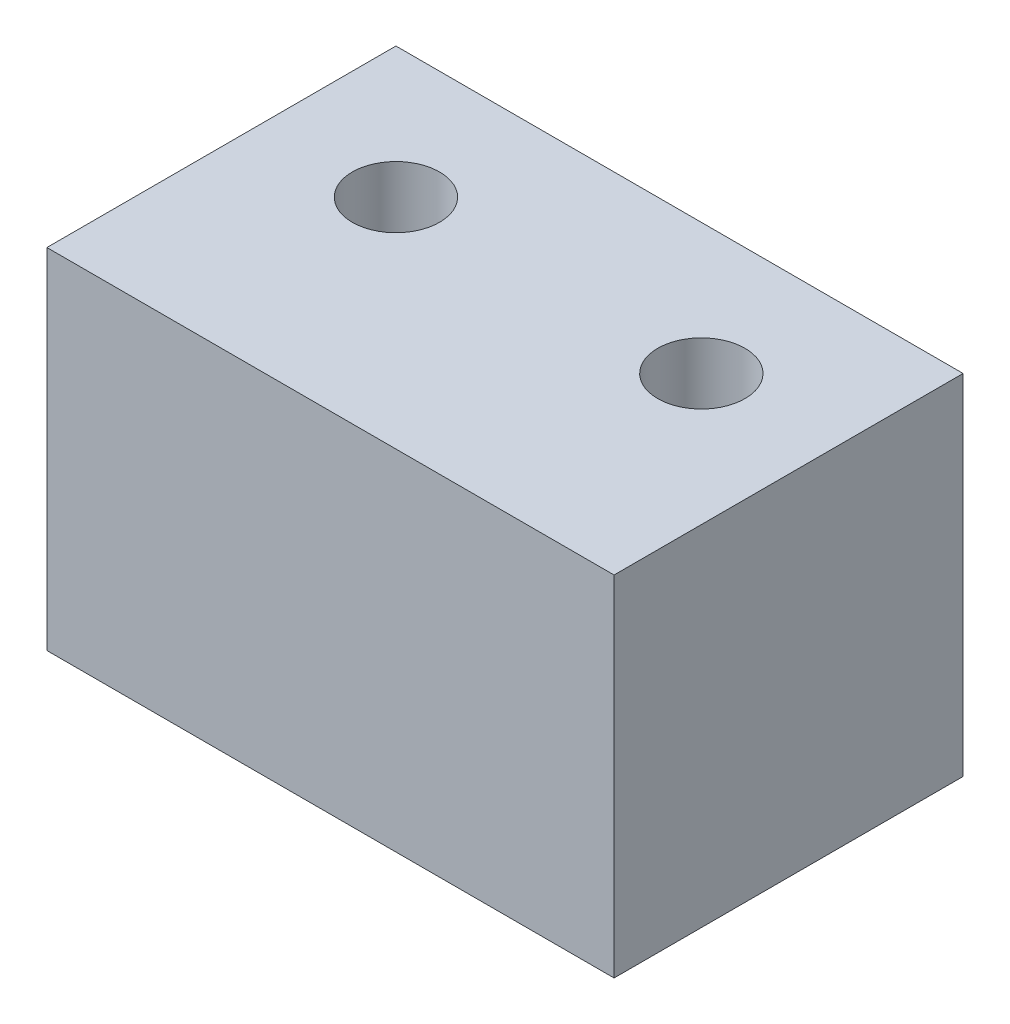
ISO-10303-21;
HEADER;
FILE_DESCRIPTION(('STEP AP214'),'2;1');
FILE_NAME('part.step','',(''),(''),'','','');
FILE_SCHEMA(('AUTOMOTIVE_DESIGN { 1 0 10303 214 1 1 1 1 }'));
ENDSEC;
DATA;
#1=APPLICATION_CONTEXT('core data for automotive mechanical design processes');
#2=APPLICATION_PROTOCOL_DEFINITION('international standard','automotive_design',2000,#1);
#3=PRODUCT_CONTEXT('',#1,'mechanical');
#4=PRODUCT('Part','Part','',(#3));
#5=PRODUCT_RELATED_PRODUCT_CATEGORY('part','',(#4));
#6=PRODUCT_DEFINITION_FORMATION('','',#4);
#7=PRODUCT_DEFINITION_CONTEXT('part definition',#1,'design');
#8=PRODUCT_DEFINITION('design','',#6,#7);
#9=PRODUCT_DEFINITION_SHAPE('','',#8);
#10=(LENGTH_UNIT() NAMED_UNIT(*) SI_UNIT(.MILLI.,.METRE.));
#11=(NAMED_UNIT(*) PLANE_ANGLE_UNIT() SI_UNIT($,.RADIAN.));
#12=(NAMED_UNIT(*) SI_UNIT($,.STERADIAN.) SOLID_ANGLE_UNIT());
#13=UNCERTAINTY_MEASURE_WITH_UNIT(LENGTH_MEASURE(1.E-05),#10,'distance_accuracy_value','');
#14=(GEOMETRIC_REPRESENTATION_CONTEXT(3) GLOBAL_UNCERTAINTY_ASSIGNED_CONTEXT((#13)) GLOBAL_UNIT_ASSIGNED_CONTEXT((#10,
#11,#12)) REPRESENTATION_CONTEXT('',''));
#15=CARTESIAN_POINT('',(0.,0.,0.));
#16=DIRECTION('',(0.,0.,1.));
#17=DIRECTION('',(1.,0.,0.));
#18=AXIS2_PLACEMENT_3D('',#15,#16,#17);
#19=CARTESIAN_POINT('',(-41.275,25.4,25.4));
#20=DIRECTION('',(-1.,0.,0.));
#21=DIRECTION('',(0.,0.,1.));
#22=AXIS2_PLACEMENT_3D('',#19,#20,#21);
#23=PLANE('',#22);
#24=CARTESIAN_POINT('',(-41.275,12.7,0.));
#25=DIRECTION('',(-1.,0.,0.));
#26=DIRECTION('',(0.,0.,1.));
#27=AXIS2_PLACEMENT_3D('',#24,#25,#26);
#28=CIRCLE('',#27,2.55269999999999);
#29=CARTESIAN_POINT('',(-41.275,12.7,2.55269999999999));
#30=VERTEX_POINT('',#29);
#31=EDGE_CURVE('E105',#30,#30,#28,.T.);
#32=ORIENTED_EDGE('',*,*,#31,.F.);
#33=EDGE_LOOP('',(#32));
#34=FACE_BOUND('',#33,.T.);
#35=CARTESIAN_POINT('',(-41.275,-12.7,0.));
#36=DIRECTION('',(-1.,0.,0.));
#37=DIRECTION('',(0.,0.,1.));
#38=AXIS2_PLACEMENT_3D('',#35,#36,#37);
#39=CIRCLE('',#38,2.55269999999999);
#40=CARTESIAN_POINT('',(-41.275,-12.7,2.55269999999999));
#41=VERTEX_POINT('',#40);
#42=EDGE_CURVE('E104',#41,#41,#39,.T.);
#43=ORIENTED_EDGE('',*,*,#42,.F.);
#44=EDGE_LOOP('',(#43));
#45=FACE_BOUND('',#44,.T.);
#46=DIRECTION('',(0.,0.,-1.));
#47=VECTOR('',#46,1.);
#48=CARTESIAN_POINT('',(-41.275,-25.4,25.4));
#49=LINE('',#48,#47);
#50=CARTESIAN_POINT('',(-41.275,-25.4,25.4));
#51=VERTEX_POINT('',#50);
#52=CARTESIAN_POINT('',(-41.275,-25.4,-25.4));
#53=VERTEX_POINT('',#52);
#54=EDGE_CURVE('E134',#51,#53,#49,.T.);
#55=ORIENTED_EDGE('',*,*,#54,.F.);
#56=DIRECTION('',(0.,-1.,0.));
#57=VECTOR('',#56,1.);
#58=CARTESIAN_POINT('',(-41.275,25.4,25.4));
#59=LINE('',#58,#57);
#60=CARTESIAN_POINT('',(-41.275,25.4,25.4));
#61=VERTEX_POINT('',#60);
#62=EDGE_CURVE('E11',#61,#51,#59,.T.);
#63=ORIENTED_EDGE('',*,*,#62,.F.);
#64=DIRECTION('',(0.,0.,-1.));
#65=VECTOR('',#64,1.);
#66=CARTESIAN_POINT('',(-41.275,25.4,25.4));
#67=LINE('',#66,#65);
#68=CARTESIAN_POINT('',(-41.275,25.4,-25.4));
#69=VERTEX_POINT('',#68);
#70=EDGE_CURVE('E135',#61,#69,#67,.T.);
#71=ORIENTED_EDGE('',*,*,#70,.T.);
#72=DIRECTION('',(0.,-1.,0.));
#73=VECTOR('',#72,1.);
#74=CARTESIAN_POINT('',(-41.275,25.4,-25.4));
#75=LINE('',#74,#73);
#76=EDGE_CURVE('E45',#69,#53,#75,.T.);
#77=ORIENTED_EDGE('',*,*,#76,.T.);
#78=EDGE_LOOP('',(#55,#63,#71,#77));
#79=FACE_BOUND('',#78,.T.);
#80=ADVANCED_FACE('F42',(#34,#45,#79),#23,.T.);
#81=CARTESIAN_POINT('',(-41.275,25.4,25.4));
#82=DIRECTION('',(0.,0.,-1.));
#83=DIRECTION('',(-1.,0.,0.));
#84=AXIS2_PLACEMENT_3D('',#81,#82,#83);
#85=PLANE('',#84);
#86=DIRECTION('',(1.,0.,0.));
#87=VECTOR('',#86,1.);
#88=CARTESIAN_POINT('',(-41.275,-25.4,25.4));
#89=LINE('',#88,#87);
#90=CARTESIAN_POINT('',(41.275,-25.4,25.4));
#91=VERTEX_POINT('',#90);
#92=EDGE_CURVE('E77',#51,#91,#89,.T.);
#93=ORIENTED_EDGE('',*,*,#92,.T.);
#94=DIRECTION('',(0.,-1.,0.));
#95=VECTOR('',#94,1.);
#96=CARTESIAN_POINT('',(41.275,25.4,25.4));
#97=LINE('',#96,#95);
#98=CARTESIAN_POINT('',(41.275,25.4,25.4));
#99=VERTEX_POINT('',#98);
#100=EDGE_CURVE('E52',#99,#91,#97,.T.);
#101=ORIENTED_EDGE('',*,*,#100,.F.);
#102=DIRECTION('',(1.,0.,0.));
#103=VECTOR('',#102,1.);
#104=CARTESIAN_POINT('',(-41.275,25.4,25.4));
#105=LINE('',#104,#103);
#106=EDGE_CURVE('E144',#61,#99,#105,.T.);
#107=ORIENTED_EDGE('',*,*,#106,.F.);
#108=ORIENTED_EDGE('',*,*,#62,.T.);
#109=EDGE_LOOP('',(#93,#101,#107,#108));
#110=FACE_BOUND('',#109,.T.);
#111=ADVANCED_FACE('F173',(#110),#85,.F.);
#112=CARTESIAN_POINT('',(41.275,25.4,25.4));
#113=DIRECTION('',(-1.,0.,0.));
#114=DIRECTION('',(0.,0.,1.));
#115=AXIS2_PLACEMENT_3D('',#112,#113,#114);
#116=PLANE('',#115);
#117=DIRECTION('',(0.,0.,-1.));
#118=VECTOR('',#117,1.);
#119=CARTESIAN_POINT('',(41.275,-25.4,25.4));
#120=LINE('',#119,#118);
#121=CARTESIAN_POINT('',(41.275,-25.4,-25.4));
#122=VERTEX_POINT('',#121);
#123=EDGE_CURVE('E154',#91,#122,#120,.T.);
#124=ORIENTED_EDGE('',*,*,#123,.T.);
#125=DIRECTION('',(0.,-1.,0.));
#126=VECTOR('',#125,1.);
#127=CARTESIAN_POINT('',(41.275,25.4,-25.4));
#128=LINE('',#127,#126);
#129=CARTESIAN_POINT('',(41.275,25.4,-25.4));
#130=VERTEX_POINT('',#129);
#131=EDGE_CURVE('E161',#130,#122,#128,.T.);
#132=ORIENTED_EDGE('',*,*,#131,.F.);
#133=DIRECTION('',(0.,0.,-1.));
#134=VECTOR('',#133,1.);
#135=CARTESIAN_POINT('',(41.275,25.4,25.4));
#136=LINE('',#135,#134);
#137=EDGE_CURVE('E141',#99,#130,#136,.T.);
#138=ORIENTED_EDGE('',*,*,#137,.F.);
#139=ORIENTED_EDGE('',*,*,#100,.T.);
#140=EDGE_LOOP('',(#124,#132,#138,#139));
#141=FACE_BOUND('',#140,.T.);
#142=ADVANCED_FACE('F171',(#141),#116,.F.);
#143=CARTESIAN_POINT('',(-41.275,25.4,-25.4));
#144=DIRECTION('',(0.,0.,-1.));
#145=DIRECTION('',(-1.,0.,0.));
#146=AXIS2_PLACEMENT_3D('',#143,#144,#145);
#147=PLANE('',#146);
#148=DIRECTION('',(1.,0.,0.));
#149=VECTOR('',#148,1.);
#150=CARTESIAN_POINT('',(-41.275,-25.4,-25.4));
#151=LINE('',#150,#149);
#152=EDGE_CURVE('E150',#53,#122,#151,.T.);
#153=ORIENTED_EDGE('',*,*,#152,.F.);
#154=ORIENTED_EDGE('',*,*,#76,.F.);
#155=DIRECTION('',(1.,0.,0.));
#156=VECTOR('',#155,1.);
#157=CARTESIAN_POINT('',(-41.275,25.4,-25.4));
#158=LINE('',#157,#156);
#159=EDGE_CURVE('E138',#69,#130,#158,.T.);
#160=ORIENTED_EDGE('',*,*,#159,.T.);
#161=ORIENTED_EDGE('',*,*,#131,.T.);
#162=EDGE_LOOP('',(#153,#154,#160,#161));
#163=FACE_BOUND('',#162,.T.);
#164=ADVANCED_FACE('F166',(#163),#147,.T.);
#165=CARTESIAN_POINT('',(0.,25.4,0.));
#166=DIRECTION('',(0.,-1.,0.));
#167=DIRECTION('',(0.,0.,-1.));
#168=AXIS2_PLACEMENT_3D('',#165,#166,#167);
#169=PLANE('',#168);
#170=CARTESIAN_POINT('',(22.225,25.4,-6.34999999999999));
#171=DIRECTION('',(0.,1.,0.));
#172=DIRECTION('',(0.,0.,1.));
#173=AXIS2_PLACEMENT_3D('',#170,#171,#172);
#174=CIRCLE('',#173,6.34999999999999);
#175=CARTESIAN_POINT('',(22.225,25.4,0.));
#176=VERTEX_POINT('',#175);
#177=EDGE_CURVE('E118',#176,#176,#174,.T.);
#178=ORIENTED_EDGE('',*,*,#177,.F.);
#179=EDGE_LOOP('',(#178));
#180=FACE_BOUND('',#179,.T.);
#181=CARTESIAN_POINT('',(-22.225,25.4,-6.34999999999999));
#182=DIRECTION('',(0.,1.,0.));
#183=DIRECTION('',(0.,0.,1.));
#184=AXIS2_PLACEMENT_3D('',#181,#182,#183);
#185=CIRCLE('',#184,6.34999999999999);
#186=CARTESIAN_POINT('',(-22.225,25.4,0.));
#187=VERTEX_POINT('',#186);
#188=EDGE_CURVE('E126',#187,#187,#185,.T.);
#189=ORIENTED_EDGE('',*,*,#188,.F.);
#190=EDGE_LOOP('',(#189));
#191=FACE_BOUND('',#190,.T.);
#192=ORIENTED_EDGE('',*,*,#70,.F.);
#193=ORIENTED_EDGE('',*,*,#106,.T.);
#194=ORIENTED_EDGE('',*,*,#137,.T.);
#195=ORIENTED_EDGE('',*,*,#159,.F.);
#196=EDGE_LOOP('',(#192,#193,#194,#195));
#197=FACE_BOUND('',#196,.T.);
#198=ADVANCED_FACE('F175',(#180,#191,#197),#169,.F.);
#199=CARTESIAN_POINT('',(0.,-25.4,0.));
#200=DIRECTION('',(0.,-1.,0.));
#201=DIRECTION('',(0.,0.,-1.));
#202=AXIS2_PLACEMENT_3D('',#199,#200,#201);
#203=PLANE('',#202);
#204=CARTESIAN_POINT('',(22.225,-25.4,-6.34999999999999));
#205=DIRECTION('',(0.,1.,0.));
#206=DIRECTION('',(0.,0.,1.));
#207=AXIS2_PLACEMENT_3D('',#204,#205,#206);
#208=CIRCLE('',#207,6.34999999999999);
#209=CARTESIAN_POINT('',(22.225,-25.4,0.));
#210=VERTEX_POINT('',#209);
#211=EDGE_CURVE('E122',#210,#210,#208,.T.);
#212=ORIENTED_EDGE('',*,*,#211,.T.);
#213=EDGE_LOOP('',(#212));
#214=FACE_BOUND('',#213,.T.);
#215=CARTESIAN_POINT('',(-22.225,-25.4,-6.34999999999999));
#216=DIRECTION('',(0.,1.,0.));
#217=DIRECTION('',(0.,0.,1.));
#218=AXIS2_PLACEMENT_3D('',#215,#216,#217);
#219=CIRCLE('',#218,6.34999999999999);
#220=CARTESIAN_POINT('',(-22.225,-25.4,0.));
#221=VERTEX_POINT('',#220);
#222=EDGE_CURVE('E130',#221,#221,#219,.T.);
#223=ORIENTED_EDGE('',*,*,#222,.T.);
#224=EDGE_LOOP('',(#223));
#225=FACE_BOUND('',#224,.T.);
#226=ORIENTED_EDGE('',*,*,#54,.T.);
#227=ORIENTED_EDGE('',*,*,#152,.T.);
#228=ORIENTED_EDGE('',*,*,#123,.F.);
#229=ORIENTED_EDGE('',*,*,#92,.F.);
#230=EDGE_LOOP('',(#226,#227,#228,#229));
#231=FACE_BOUND('',#230,.T.);
#232=ADVANCED_FACE('F169',(#214,#225,#231),#203,.T.);
#233=CARTESIAN_POINT('',(-22.225,25.4,-6.34999999999999));
#234=DIRECTION('',(0.,1.,0.));
#235=DIRECTION('',(0.,0.,1.));
#236=AXIS2_PLACEMENT_3D('',#233,#234,#235);
#237=CYLINDRICAL_SURFACE('',#236,6.34999999999999);
#238=ORIENTED_EDGE('',*,*,#222,.F.);
#239=EDGE_LOOP('',(#238));
#240=FACE_BOUND('',#239,.T.);
#241=ORIENTED_EDGE('',*,*,#188,.T.);
#242=EDGE_LOOP('',(#241));
#243=FACE_BOUND('',#242,.T.);
#244=ADVANCED_FACE('F183',(#240,#243),#237,.F.);
#245=CARTESIAN_POINT('',(22.225,25.4,-6.34999999999999));
#246=DIRECTION('',(0.,1.,0.));
#247=DIRECTION('',(0.,0.,1.));
#248=AXIS2_PLACEMENT_3D('',#245,#246,#247);
#249=CYLINDRICAL_SURFACE('',#248,6.34999999999999);
#250=ORIENTED_EDGE('',*,*,#211,.F.);
#251=EDGE_LOOP('',(#250));
#252=FACE_BOUND('',#251,.T.);
#253=ORIENTED_EDGE('',*,*,#177,.T.);
#254=EDGE_LOOP('',(#253));
#255=FACE_BOUND('',#254,.T.);
#256=ADVANCED_FACE('F207',(#252,#255),#249,.F.);
#257=CARTESIAN_POINT('',(-28.575,-12.7,0.));
#258=DIRECTION('',(-1.,0.,0.));
#259=DIRECTION('',(0.,0.,1.));
#260=AXIS2_PLACEMENT_3D('',#257,#258,#259);
#261=CONICAL_SURFACE('',#260,2.5527,1.02974425867665);
#262=CARTESIAN_POINT('',(-27.0411830978084,-12.7,0.));
#263=VERTEX_POINT('',#262);
#264=VERTEX_LOOP('',#263);
#265=FACE_BOUND('',#264,.T.);
#266=CARTESIAN_POINT('',(-28.575,-12.7,0.));
#267=DIRECTION('',(-1.,0.,0.));
#268=DIRECTION('',(0.,0.,1.));
#269=AXIS2_PLACEMENT_3D('',#266,#267,#268);
#270=CIRCLE('',#269,2.5527);
#271=CARTESIAN_POINT('',(-28.575,-12.7,2.5527));
#272=VERTEX_POINT('',#271);
#273=EDGE_CURVE('E110',#272,#272,#270,.T.);
#274=ORIENTED_EDGE('',*,*,#273,.T.);
#275=EDGE_LOOP('',(#274));
#276=FACE_BOUND('',#275,.T.);
#277=ADVANCED_FACE('F201',(#265,#276),#261,.F.);
#278=CARTESIAN_POINT('',(-41.275,-12.7,0.));
#279=DIRECTION('',(-1.,0.,0.));
#280=DIRECTION('',(0.,0.,1.));
#281=AXIS2_PLACEMENT_3D('',#278,#279,#280);
#282=CYLINDRICAL_SURFACE('',#281,2.55269999999999);
#283=ORIENTED_EDGE('',*,*,#273,.F.);
#284=EDGE_LOOP('',(#283));
#285=FACE_BOUND('',#284,.T.);
#286=ORIENTED_EDGE('',*,*,#42,.T.);
#287=EDGE_LOOP('',(#286));
#288=FACE_BOUND('',#287,.T.);
#289=ADVANCED_FACE('F97',(#285,#288),#282,.F.);
#290=CARTESIAN_POINT('',(-28.575,12.7,0.));
#291=DIRECTION('',(-1.,0.,0.));
#292=DIRECTION('',(0.,0.,1.));
#293=AXIS2_PLACEMENT_3D('',#290,#291,#292);
#294=CONICAL_SURFACE('',#293,2.5527,1.02974425867665);
#295=CARTESIAN_POINT('',(-27.0411830978084,12.7,0.));
#296=VERTEX_POINT('',#295);
#297=VERTEX_LOOP('',#296);
#298=FACE_BOUND('',#297,.T.);
#299=CARTESIAN_POINT('',(-28.575,12.7,0.));
#300=DIRECTION('',(-1.,0.,0.));
#301=DIRECTION('',(0.,0.,1.));
#302=AXIS2_PLACEMENT_3D('',#299,#300,#301);
#303=CIRCLE('',#302,2.5527);
#304=CARTESIAN_POINT('',(-28.575,12.7,2.5527));
#305=VERTEX_POINT('',#304);
#306=EDGE_CURVE('E101',#305,#305,#303,.T.);
#307=ORIENTED_EDGE('',*,*,#306,.T.);
#308=EDGE_LOOP('',(#307));
#309=FACE_BOUND('',#308,.T.);
#310=ADVANCED_FACE('F93',(#298,#309),#294,.F.);
#311=CARTESIAN_POINT('',(-41.275,12.7,0.));
#312=DIRECTION('',(-1.,0.,0.));
#313=DIRECTION('',(0.,0.,1.));
#314=AXIS2_PLACEMENT_3D('',#311,#312,#313);
#315=CYLINDRICAL_SURFACE('',#314,2.55269999999999);
#316=ORIENTED_EDGE('',*,*,#306,.F.);
#317=EDGE_LOOP('',(#316));
#318=FACE_BOUND('',#317,.T.);
#319=ORIENTED_EDGE('',*,*,#31,.T.);
#320=EDGE_LOOP('',(#319));
#321=FACE_BOUND('',#320,.T.);
#322=ADVANCED_FACE('F96',(#318,#321),#315,.F.);
#323=CLOSED_SHELL('',(#80,#111,#142,#164,#198,#232,#244,#256,#277,#289,#310,#322));
#324=MANIFOLD_SOLID_BREP('B2',#323);
#325=ADVANCED_BREP_SHAPE_REPRESENTATION('',(#18,#324),#14);
#326=SHAPE_DEFINITION_REPRESENTATION(#9,#325);
ENDSEC;
END-ISO-10303-21;
